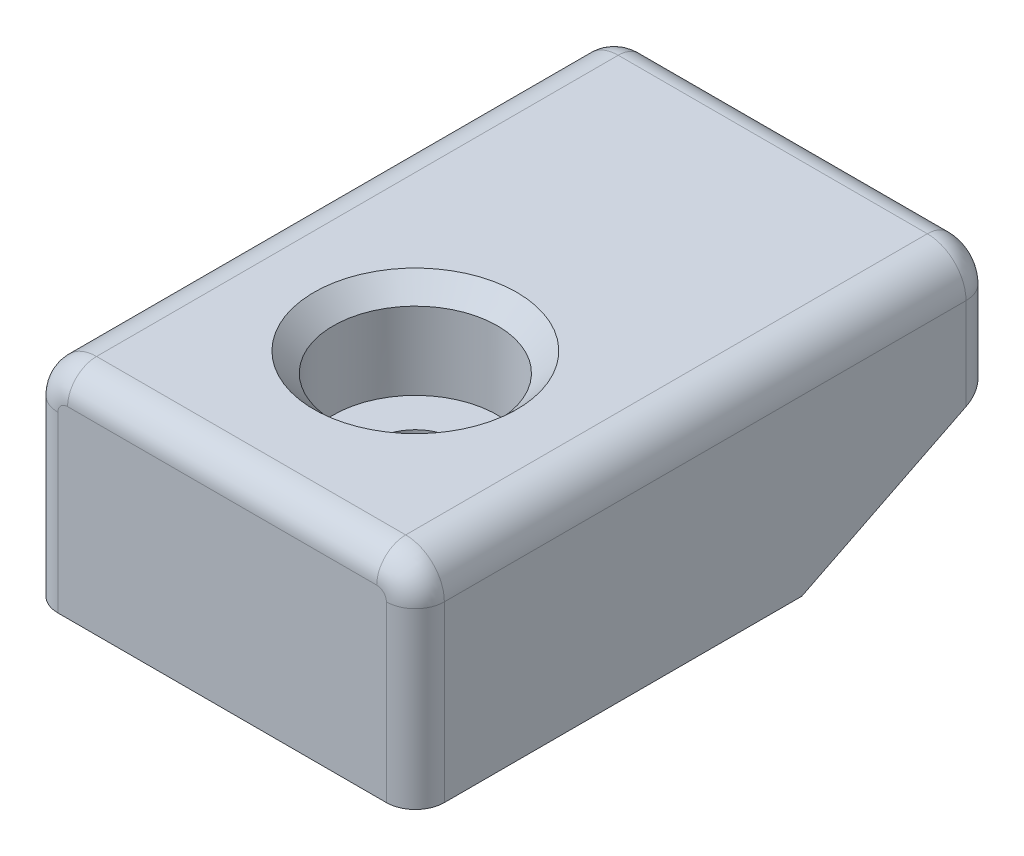
ISO-10303-21;
HEADER;
FILE_DESCRIPTION(('STEP AP214'),'2;1');
FILE_NAME('part.step','',(''),(''),'','','');
FILE_SCHEMA(('AUTOMOTIVE_DESIGN { 1 0 10303 214 1 1 1 1 }'));
ENDSEC;
DATA;
#1=APPLICATION_CONTEXT('core data for automotive mechanical design processes');
#2=APPLICATION_PROTOCOL_DEFINITION('international standard','automotive_design',2000,#1);
#3=PRODUCT_CONTEXT('',#1,'mechanical');
#4=PRODUCT('Part','Part','',(#3));
#5=PRODUCT_RELATED_PRODUCT_CATEGORY('part','',(#4));
#6=PRODUCT_DEFINITION_FORMATION('','',#4);
#7=PRODUCT_DEFINITION_CONTEXT('part definition',#1,'design');
#8=PRODUCT_DEFINITION('design','',#6,#7);
#9=PRODUCT_DEFINITION_SHAPE('','',#8);
#10=(LENGTH_UNIT() NAMED_UNIT(*) SI_UNIT(.MILLI.,.METRE.));
#11=(NAMED_UNIT(*) PLANE_ANGLE_UNIT() SI_UNIT($,.RADIAN.));
#12=(NAMED_UNIT(*) SI_UNIT($,.STERADIAN.) SOLID_ANGLE_UNIT());
#13=UNCERTAINTY_MEASURE_WITH_UNIT(LENGTH_MEASURE(1.E-05),#10,'distance_accuracy_value','');
#14=(GEOMETRIC_REPRESENTATION_CONTEXT(3) GLOBAL_UNCERTAINTY_ASSIGNED_CONTEXT((#13)) GLOBAL_UNIT_ASSIGNED_CONTEXT((#10,
#11,#12)) REPRESENTATION_CONTEXT('',''));
#15=CARTESIAN_POINT('',(0.,0.,0.));
#16=DIRECTION('',(0.,0.,1.));
#17=DIRECTION('',(1.,0.,0.));
#18=AXIS2_PLACEMENT_3D('',#15,#16,#17);
#19=CARTESIAN_POINT('',(0.,11.,9.91087244163016));
#20=DIRECTION('',(0.,-1.,0.));
#21=DIRECTION('',(0.,0.,-1.));
#22=AXIS2_PLACEMENT_3D('',#19,#20,#21);
#23=CYLINDRICAL_SURFACE('',#22,4.15);
#24=CARTESIAN_POINT('',(0.,-11.,9.91087244163016));
#25=DIRECTION('',(0.,1.,0.));
#26=DIRECTION('',(0.,0.,1.));
#27=AXIS2_PLACEMENT_3D('',#24,#25,#26);
#28=CIRCLE('',#27,4.15);
#29=CARTESIAN_POINT('',(0.,-11.,14.0608724416302));
#30=VERTEX_POINT('',#29);
#31=EDGE_CURVE('E294',#30,#30,#28,.T.);
#32=ORIENTED_EDGE('',*,*,#31,.F.);
#33=EDGE_LOOP('',(#32));
#34=FACE_BOUND('',#33,.T.);
#35=CARTESIAN_POINT('',(0.,0.999999999999999,9.91087244163016));
#36=DIRECTION('',(0.,1.,0.));
#37=DIRECTION('',(0.,0.,1.));
#38=AXIS2_PLACEMENT_3D('',#35,#36,#37);
#39=CIRCLE('',#38,4.15);
#40=CARTESIAN_POINT('',(0.,0.999999999999999,14.0608724416302));
#41=VERTEX_POINT('',#40);
#42=EDGE_CURVE('E291',#41,#41,#39,.T.);
#43=ORIENTED_EDGE('',*,*,#42,.T.);
#44=EDGE_LOOP('',(#43));
#45=FACE_BOUND('',#44,.T.);
#46=ADVANCED_FACE('F42',(#34,#45),#23,.F.);
#47=CARTESIAN_POINT('',(0.,11.,0.));
#48=DIRECTION('',(0.,-1.,0.));
#49=DIRECTION('',(0.,0.,-1.));
#50=AXIS2_PLACEMENT_3D('',#47,#48,#49);
#51=PLANE('',#50);
#52=CARTESIAN_POINT('',(0.,11.,9.91087244163016));
#53=DIRECTION('',(0.,-1.,0.));
#54=DIRECTION('',(0.,0.,-1.));
#55=AXIS2_PLACEMENT_3D('',#52,#53,#54);
#56=CIRCLE('',#55,10.5);
#57=CARTESIAN_POINT('',(0.,11.,-0.589127558369852));
#58=VERTEX_POINT('',#57);
#59=EDGE_CURVE('E310',#58,#58,#56,.T.);
#60=ORIENTED_EDGE('',*,*,#59,.T.);
#61=EDGE_LOOP('',(#60));
#62=FACE_BOUND('',#61,.T.);
#63=DIRECTION('',(0.,0.,1.));
#64=VECTOR('',#63,1.);
#65=CARTESIAN_POINT('',(-16.0000000000001,11.,0.));
#66=LINE('',#65,#64);
#67=CARTESIAN_POINT('',(-16.0000000000001,11.,-27.0891275583698));
#68=VERTEX_POINT('',#67);
#69=CARTESIAN_POINT('',(-16.0000000000001,11.,26.9108724416302));
#70=VERTEX_POINT('',#69);
#71=EDGE_CURVE('E287',#68,#70,#66,.T.);
#72=ORIENTED_EDGE('',*,*,#71,.T.);
#73=DIRECTION('',(1.,0.,0.));
#74=VECTOR('',#73,1.);
#75=CARTESIAN_POINT('',(0.,11.,26.9108724416302));
#76=LINE('',#75,#74);
#77=CARTESIAN_POINT('',(15.9999999999999,11.,26.9108724416302));
#78=VERTEX_POINT('',#77);
#79=EDGE_CURVE('E11',#70,#78,#76,.T.);
#80=ORIENTED_EDGE('',*,*,#79,.T.);
#81=DIRECTION('',(0.,0.,-1.));
#82=VECTOR('',#81,1.);
#83=CARTESIAN_POINT('',(15.9999999999999,11.,0.));
#84=LINE('',#83,#82);
#85=CARTESIAN_POINT('',(15.9999999999999,11.,-27.0891275583698));
#86=VERTEX_POINT('',#85);
#87=EDGE_CURVE('E283',#78,#86,#84,.T.);
#88=ORIENTED_EDGE('',*,*,#87,.T.);
#89=DIRECTION('',(-1.,0.,0.));
#90=VECTOR('',#89,1.);
#91=CARTESIAN_POINT('',(0.,11.,-27.0891275583698));
#92=LINE('',#91,#90);
#93=EDGE_CURVE('E52',#86,#68,#92,.T.);
#94=ORIENTED_EDGE('',*,*,#93,.T.);
#95=EDGE_LOOP('',(#72,#80,#88,#94));
#96=FACE_BOUND('',#95,.T.);
#97=ADVANCED_FACE('F370',(#62,#96),#51,.F.);
#98=CARTESIAN_POINT('',(0.,-11.,0.));
#99=DIRECTION('',(0.,-1.,0.));
#100=DIRECTION('',(0.,0.,-1.));
#101=AXIS2_PLACEMENT_3D('',#98,#99,#100);
#102=PLANE('',#101);
#103=DIRECTION('',(0.,0.,-1.));
#104=VECTOR('',#103,1.);
#105=CARTESIAN_POINT('',(19.9999999999999,-11.,29.9108724416302));
#106=LINE('',#105,#104);
#107=CARTESIAN_POINT('',(19.9999999999999,-11.,26.9108724416302));
#108=VERTEX_POINT('',#107);
#109=CARTESIAN_POINT('',(19.9999999999999,-11.,-10.0891275583697));
#110=VERTEX_POINT('',#109);
#111=EDGE_CURVE('E164',#108,#110,#106,.T.);
#112=ORIENTED_EDGE('',*,*,#111,.F.);
#113=CARTESIAN_POINT('',(17.,-11.,26.9108724416302));
#114=DIRECTION('',(0.,-1.,0.));
#115=DIRECTION('',(0.,0.,-1.));
#116=AXIS2_PLACEMENT_3D('',#113,#114,#115);
#117=CIRCLE('',#116,3.);
#118=CARTESIAN_POINT('',(17.,-11.,29.9108724416302));
#119=VERTEX_POINT('',#118);
#120=EDGE_CURVE('E224',#108,#119,#117,.T.);
#121=ORIENTED_EDGE('',*,*,#120,.T.);
#122=DIRECTION('',(1.,0.,0.));
#123=VECTOR('',#122,1.);
#124=CARTESIAN_POINT('',(-20.0000000000001,-11.,29.9108724416302));
#125=LINE('',#124,#123);
#126=CARTESIAN_POINT('',(-17.0000000000001,-11.,29.9108724416302));
#127=VERTEX_POINT('',#126);
#128=EDGE_CURVE('E163',#127,#119,#125,.T.);
#129=ORIENTED_EDGE('',*,*,#128,.F.);
#130=CARTESIAN_POINT('',(-17.0000000000001,-11.,26.9108724416302));
#131=DIRECTION('',(0.,-1.,0.));
#132=DIRECTION('',(0.,0.,-1.));
#133=AXIS2_PLACEMENT_3D('',#130,#131,#132);
#134=CIRCLE('',#133,3.);
#135=CARTESIAN_POINT('',(-20.0000000000001,-11.,26.9108724416302));
#136=VERTEX_POINT('',#135);
#137=EDGE_CURVE('E161',#127,#136,#134,.T.);
#138=ORIENTED_EDGE('',*,*,#137,.T.);
#139=DIRECTION('',(0.,0.,1.));
#140=VECTOR('',#139,1.);
#141=CARTESIAN_POINT('',(-20.0000000000001,-11.,29.9108724416302));
#142=LINE('',#141,#140);
#143=CARTESIAN_POINT('',(-20.0000000000001,-11.,-10.0891275583697));
#144=VERTEX_POINT('',#143);
#145=EDGE_CURVE('E142',#144,#136,#142,.T.);
#146=ORIENTED_EDGE('',*,*,#145,.F.);
#147=DIRECTION('',(1.,0.,0.));
#148=VECTOR('',#147,1.);
#149=CARTESIAN_POINT('',(19.9999999999999,-11.,-10.0891275583697));
#150=LINE('',#149,#148);
#151=EDGE_CURVE('E150',#144,#110,#150,.T.);
#152=ORIENTED_EDGE('',*,*,#151,.T.);
#153=EDGE_LOOP('',(#112,#121,#129,#138,#146,#152));
#154=FACE_BOUND('',#153,.T.);
#155=ORIENTED_EDGE('',*,*,#31,.T.);
#156=EDGE_LOOP('',(#155));
#157=FACE_BOUND('',#156,.T.);
#158=ADVANCED_FACE('F156',(#154,#157),#102,.T.);
#159=CARTESIAN_POINT('',(19.9999999999999,11.,29.9108724416302));
#160=DIRECTION('',(-1.,0.,0.));
#161=DIRECTION('',(0.,0.,1.));
#162=AXIS2_PLACEMENT_3D('',#159,#160,#161);
#163=PLANE('',#162);
#164=DIRECTION('',(0.,0.447213595499956,-0.894427190999917));
#165=VECTOR('',#164,1.);
#166=CARTESIAN_POINT('',(19.9999999999999,-0.999999999999997,-30.0891275583698));
#167=LINE('',#166,#165);
#168=CARTESIAN_POINT('',(19.9999999999999,-2.49999999999999,-27.0891275583698));
#169=VERTEX_POINT('',#168);
#170=EDGE_CURVE('E169',#110,#169,#167,.T.);
#171=ORIENTED_EDGE('',*,*,#170,.T.);
#172=DIRECTION('',(0.,-1.,0.));
#173=VECTOR('',#172,1.);
#174=CARTESIAN_POINT('',(19.9999999999999,11.,-27.0891275583698));
#175=LINE('',#174,#173);
#176=CARTESIAN_POINT('',(19.9999999999999,7.,-27.0891275583698));
#177=VERTEX_POINT('',#176);
#178=EDGE_CURVE('E202',#169,#177,#175,.F.);
#179=ORIENTED_EDGE('',*,*,#178,.T.);
#180=DIRECTION('',(0.,0.,-1.));
#181=VECTOR('',#180,1.);
#182=CARTESIAN_POINT('',(19.9999999999999,7.,29.9108724416302));
#183=LINE('',#182,#181);
#184=CARTESIAN_POINT('',(19.9999999999999,7.,26.9108724416302));
#185=VERTEX_POINT('',#184);
#186=EDGE_CURVE('E302',#177,#185,#183,.F.);
#187=ORIENTED_EDGE('',*,*,#186,.T.);
#188=DIRECTION('',(0.,-1.,0.));
#189=VECTOR('',#188,1.);
#190=CARTESIAN_POINT('',(19.9999999999999,11.,26.9108724416302));
#191=LINE('',#190,#189);
#192=EDGE_CURVE('E198',#185,#108,#191,.T.);
#193=ORIENTED_EDGE('',*,*,#192,.T.);
#194=ORIENTED_EDGE('',*,*,#111,.T.);
#195=EDGE_LOOP('',(#171,#179,#187,#193,#194));
#196=FACE_BOUND('',#195,.T.);
#197=ADVANCED_FACE('F341',(#196),#163,.F.);
#198=CARTESIAN_POINT('',(-20.0000000000001,11.,-30.0891275583698));
#199=DIRECTION('',(0.,0.,1.));
#200=DIRECTION('',(1.,0.,0.));
#201=AXIS2_PLACEMENT_3D('',#198,#199,#200);
#202=PLANE('',#201);
#203=CARTESIAN_POINT('',(15.9999999999999,7.,-30.0891275583698));
#204=DIRECTION('',(0.,0.,1.));
#205=DIRECTION('',(1.,0.,0.));
#206=AXIS2_PLACEMENT_3D('',#203,#204,#205);
#207=CIRCLE('',#206,1.);
#208=CARTESIAN_POINT('',(15.9999999999999,8.,-30.0891275583698));
#209=VERTEX_POINT('',#208);
#210=CARTESIAN_POINT('',(17.,7.,-30.0891275583698));
#211=VERTEX_POINT('',#210);
#212=EDGE_CURVE('E185',#209,#211,#207,.F.);
#213=ORIENTED_EDGE('',*,*,#212,.T.);
#214=DIRECTION('',(0.,-1.,0.));
#215=VECTOR('',#214,1.);
#216=CARTESIAN_POINT('',(17.,11.,-30.0891275583698));
#217=LINE('',#216,#215);
#218=CARTESIAN_POINT('',(17.,-0.999999999999997,-30.0891275583698));
#219=VERTEX_POINT('',#218);
#220=EDGE_CURVE('E188',#211,#219,#217,.T.);
#221=ORIENTED_EDGE('',*,*,#220,.T.);
#222=DIRECTION('',(-1.,0.,0.));
#223=VECTOR('',#222,1.);
#224=CARTESIAN_POINT('',(-20.0000000000001,-0.999999999999997,-30.0891275583698));
#225=LINE('',#224,#223);
#226=CARTESIAN_POINT('',(-17.0000000000001,-0.999999999999997,-30.0891275583698));
#227=VERTEX_POINT('',#226);
#228=EDGE_CURVE('E151',#219,#227,#225,.T.);
#229=ORIENTED_EDGE('',*,*,#228,.T.);
#230=DIRECTION('',(0.,-1.,0.));
#231=VECTOR('',#230,1.);
#232=CARTESIAN_POINT('',(-17.0000000000001,11.,-30.0891275583698));
#233=LINE('',#232,#231);
#234=CARTESIAN_POINT('',(-17.0000000000001,7.,-30.0891275583698));
#235=VERTEX_POINT('',#234);
#236=EDGE_CURVE('E182',#227,#235,#233,.F.);
#237=ORIENTED_EDGE('',*,*,#236,.T.);
#238=CARTESIAN_POINT('',(-16.0000000000001,7.,-30.0891275583698));
#239=DIRECTION('',(0.,0.,1.));
#240=DIRECTION('',(1.,0.,0.));
#241=AXIS2_PLACEMENT_3D('',#238,#239,#240);
#242=CIRCLE('',#241,1.);
#243=CARTESIAN_POINT('',(-16.0000000000001,8.,-30.0891275583698));
#244=VERTEX_POINT('',#243);
#245=EDGE_CURVE('E179',#235,#244,#242,.F.);
#246=ORIENTED_EDGE('',*,*,#245,.T.);
#247=DIRECTION('',(-1.,0.,0.));
#248=VECTOR('',#247,1.);
#249=CARTESIAN_POINT('',(-20.0000000000001,8.,-30.0891275583698));
#250=LINE('',#249,#248);
#251=EDGE_CURVE('E173',#244,#209,#250,.F.);
#252=ORIENTED_EDGE('',*,*,#251,.T.);
#253=EDGE_LOOP('',(#213,#221,#229,#237,#246,#252));
#254=FACE_BOUND('',#253,.T.);
#255=ADVANCED_FACE('F317',(#254),#202,.F.);
#256=CARTESIAN_POINT('',(-20.0000000000001,11.,29.9108724416302));
#257=DIRECTION('',(1.,0.,0.));
#258=DIRECTION('',(0.,0.,-1.));
#259=AXIS2_PLACEMENT_3D('',#256,#257,#258);
#260=PLANE('',#259);
#261=DIRECTION('',(0.,0.,1.));
#262=VECTOR('',#261,1.);
#263=CARTESIAN_POINT('',(-20.0000000000001,7.,29.9108724416302));
#264=LINE('',#263,#262);
#265=CARTESIAN_POINT('',(-20.0000000000001,7.,26.9108724416302));
#266=VERTEX_POINT('',#265);
#267=CARTESIAN_POINT('',(-20.0000000000001,7.,-27.0891275583698));
#268=VERTEX_POINT('',#267);
#269=EDGE_CURVE('E299',#266,#268,#264,.F.);
#270=ORIENTED_EDGE('',*,*,#269,.T.);
#271=DIRECTION('',(0.,-1.,0.));
#272=VECTOR('',#271,1.);
#273=CARTESIAN_POINT('',(-20.0000000000001,11.,-27.0891275583698));
#274=LINE('',#273,#272);
#275=CARTESIAN_POINT('',(-20.0000000000001,-2.49999999999999,-27.0891275583698));
#276=VERTEX_POINT('',#275);
#277=EDGE_CURVE('E145',#268,#276,#274,.T.);
#278=ORIENTED_EDGE('',*,*,#277,.T.);
#279=DIRECTION('',(0.,-0.447213595499956,0.894427190999917));
#280=VECTOR('',#279,1.);
#281=CARTESIAN_POINT('',(-20.0000000000001,-0.999999999999997,-30.0891275583698));
#282=LINE('',#281,#280);
#283=EDGE_CURVE('E138',#276,#144,#282,.T.);
#284=ORIENTED_EDGE('',*,*,#283,.T.);
#285=ORIENTED_EDGE('',*,*,#145,.T.);
#286=DIRECTION('',(0.,-1.,0.));
#287=VECTOR('',#286,1.);
#288=CARTESIAN_POINT('',(-20.0000000000001,11.,26.9108724416302));
#289=LINE('',#288,#287);
#290=EDGE_CURVE('E211',#136,#266,#289,.F.);
#291=ORIENTED_EDGE('',*,*,#290,.T.);
#292=EDGE_LOOP('',(#270,#278,#284,#285,#291));
#293=FACE_BOUND('',#292,.T.);
#294=ADVANCED_FACE('F141',(#293),#260,.F.);
#295=CARTESIAN_POINT('',(-20.0000000000001,11.,29.9108724416302));
#296=DIRECTION('',(0.,0.,-1.));
#297=DIRECTION('',(-1.,0.,0.));
#298=AXIS2_PLACEMENT_3D('',#295,#296,#297);
#299=PLANE('',#298);
#300=ORIENTED_EDGE('',*,*,#128,.T.);
#301=DIRECTION('',(0.,-1.,0.));
#302=VECTOR('',#301,1.);
#303=CARTESIAN_POINT('',(17.,11.,29.9108724416302));
#304=LINE('',#303,#302);
#305=CARTESIAN_POINT('',(17.,7.,29.9108724416302));
#306=VERTEX_POINT('',#305);
#307=EDGE_CURVE('E60',#119,#306,#304,.F.);
#308=ORIENTED_EDGE('',*,*,#307,.T.);
#309=CARTESIAN_POINT('',(15.9999999999999,7.,29.9108724416302));
#310=DIRECTION('',(0.,0.,-1.));
#311=DIRECTION('',(-1.,0.,0.));
#312=AXIS2_PLACEMENT_3D('',#309,#310,#311);
#313=CIRCLE('',#312,1.);
#314=CARTESIAN_POINT('',(15.9999999999999,8.,29.9108724416302));
#315=VERTEX_POINT('',#314);
#316=EDGE_CURVE('E64',#306,#315,#313,.F.);
#317=ORIENTED_EDGE('',*,*,#316,.T.);
#318=DIRECTION('',(1.,0.,0.));
#319=VECTOR('',#318,1.);
#320=CARTESIAN_POINT('',(-20.0000000000001,8.,29.9108724416302));
#321=LINE('',#320,#319);
#322=CARTESIAN_POINT('',(-16.0000000000001,8.,29.9108724416302));
#323=VERTEX_POINT('',#322);
#324=EDGE_CURVE('E233',#315,#323,#321,.F.);
#325=ORIENTED_EDGE('',*,*,#324,.T.);
#326=CARTESIAN_POINT('',(-16.0000000000001,7.,29.9108724416302));
#327=DIRECTION('',(0.,0.,-1.));
#328=DIRECTION('',(-1.,0.,0.));
#329=AXIS2_PLACEMENT_3D('',#326,#327,#328);
#330=CIRCLE('',#329,1.);
#331=CARTESIAN_POINT('',(-17.0000000000001,7.,29.9108724416302));
#332=VERTEX_POINT('',#331);
#333=EDGE_CURVE('E230',#323,#332,#330,.F.);
#334=ORIENTED_EDGE('',*,*,#333,.T.);
#335=DIRECTION('',(0.,-1.,0.));
#336=VECTOR('',#335,1.);
#337=CARTESIAN_POINT('',(-17.0000000000001,11.,29.9108724416302));
#338=LINE('',#337,#336);
#339=EDGE_CURVE('E227',#332,#127,#338,.T.);
#340=ORIENTED_EDGE('',*,*,#339,.T.);
#341=EDGE_LOOP('',(#300,#308,#317,#325,#334,#340));
#342=FACE_BOUND('',#341,.T.);
#343=ADVANCED_FACE('F281',(#342),#299,.F.);
#344=CARTESIAN_POINT('',(0.,0.999999999999999,9.91087244163016));
#345=DIRECTION('',(0.,1.,0.));
#346=DIRECTION('',(0.,0.,1.));
#347=AXIS2_PLACEMENT_3D('',#344,#345,#346);
#348=CYLINDRICAL_SURFACE('',#347,8.5);
#349=CARTESIAN_POINT('',(0.,8.99999999999999,9.91087244163016));
#350=DIRECTION('',(0.,-1.,0.));
#351=DIRECTION('',(0.,0.,-1.));
#352=AXIS2_PLACEMENT_3D('',#349,#350,#351);
#353=CIRCLE('',#352,8.5);
#354=CARTESIAN_POINT('',(0.,8.99999999999999,1.41087244163016));
#355=VERTEX_POINT('',#354);
#356=EDGE_CURVE('E306',#355,#355,#353,.F.);
#357=ORIENTED_EDGE('',*,*,#356,.T.);
#358=EDGE_LOOP('',(#357));
#359=FACE_BOUND('',#358,.T.);
#360=CARTESIAN_POINT('',(0.,0.999999999999999,9.91087244163016));
#361=DIRECTION('',(0.,1.,0.));
#362=DIRECTION('',(0.,0.,1.));
#363=AXIS2_PLACEMENT_3D('',#360,#361,#362);
#364=CIRCLE('',#363,8.5);
#365=CARTESIAN_POINT('',(0.,0.999999999999999,18.4108724416302));
#366=VERTEX_POINT('',#365);
#367=EDGE_CURVE('E258',#366,#366,#364,.T.);
#368=ORIENTED_EDGE('',*,*,#367,.F.);
#369=EDGE_LOOP('',(#368));
#370=FACE_BOUND('',#369,.T.);
#371=ADVANCED_FACE('F355',(#359,#370),#348,.F.);
#372=CARTESIAN_POINT('',(0.,0.999999999999999,9.91087244163016));
#373=DIRECTION('',(0.,1.,0.));
#374=DIRECTION('',(0.,0.,1.));
#375=AXIS2_PLACEMENT_3D('',#372,#373,#374);
#376=PLANE('',#375);
#377=ORIENTED_EDGE('',*,*,#42,.F.);
#378=EDGE_LOOP('',(#377));
#379=FACE_BOUND('',#378,.T.);
#380=ORIENTED_EDGE('',*,*,#367,.T.);
#381=EDGE_LOOP('',(#380));
#382=FACE_BOUND('',#381,.T.);
#383=ADVANCED_FACE('F353',(#379,#382),#376,.T.);
#384=CARTESIAN_POINT('',(-16.0000000000001,7.,0.));
#385=DIRECTION('',(0.,0.,1.));
#386=DIRECTION('',(1.,0.,0.));
#387=AXIS2_PLACEMENT_3D('',#384,#385,#386);
#388=CYLINDRICAL_SURFACE('',#387,4.);
#389=ORIENTED_EDGE('',*,*,#71,.F.);
#390=CARTESIAN_POINT('',(-16.0000000000001,7.,-27.0891275583698));
#391=DIRECTION('',(0.,0.,1.));
#392=DIRECTION('',(1.,0.,0.));
#393=AXIS2_PLACEMENT_3D('',#390,#391,#392);
#394=CIRCLE('',#393,4.);
#395=EDGE_CURVE('E219',#68,#268,#394,.T.);
#396=ORIENTED_EDGE('',*,*,#395,.T.);
#397=ORIENTED_EDGE('',*,*,#269,.F.);
#398=CARTESIAN_POINT('',(-16.0000000000001,7.,26.9108724416302));
#399=DIRECTION('',(0.,0.,-1.));
#400=DIRECTION('',(-1.,0.,0.));
#401=AXIS2_PLACEMENT_3D('',#398,#399,#400);
#402=CIRCLE('',#401,4.);
#403=EDGE_CURVE('E216',#266,#70,#402,.T.);
#404=ORIENTED_EDGE('',*,*,#403,.T.);
#405=EDGE_LOOP('',(#389,#396,#397,#404));
#406=FACE_BOUND('',#405,.T.);
#407=ADVANCED_FACE('F363',(#406),#388,.T.);
#408=CARTESIAN_POINT('',(15.9999999999999,7.,0.));
#409=DIRECTION('',(0.,0.,-1.));
#410=DIRECTION('',(-1.,0.,0.));
#411=AXIS2_PLACEMENT_3D('',#408,#409,#410);
#412=CYLINDRICAL_SURFACE('',#411,4.);
#413=ORIENTED_EDGE('',*,*,#186,.F.);
#414=CARTESIAN_POINT('',(15.9999999999999,7.,-27.0891275583698));
#415=DIRECTION('',(0.,0.,1.));
#416=DIRECTION('',(1.,0.,0.));
#417=AXIS2_PLACEMENT_3D('',#414,#415,#416);
#418=CIRCLE('',#417,4.);
#419=EDGE_CURVE('E208',#177,#86,#418,.T.);
#420=ORIENTED_EDGE('',*,*,#419,.T.);
#421=ORIENTED_EDGE('',*,*,#87,.F.);
#422=CARTESIAN_POINT('',(15.9999999999999,7.,26.9108724416302));
#423=DIRECTION('',(0.,0.,-1.));
#424=DIRECTION('',(-1.,0.,0.));
#425=AXIS2_PLACEMENT_3D('',#422,#423,#424);
#426=CIRCLE('',#425,4.);
#427=EDGE_CURVE('E205',#78,#185,#426,.T.);
#428=ORIENTED_EDGE('',*,*,#427,.T.);
#429=EDGE_LOOP('',(#413,#420,#421,#428));
#430=FACE_BOUND('',#429,.T.);
#431=ADVANCED_FACE('F391',(#430),#412,.T.);
#432=CARTESIAN_POINT('',(0.,8.99999999999999,9.91087244163016));
#433=DIRECTION('',(0.,1.,0.));
#434=DIRECTION('',(0.,0.,1.));
#435=AXIS2_PLACEMENT_3D('',#432,#433,#434);
#436=CONICAL_SURFACE('',#435,8.5,0.78539816339745);
#437=ORIENTED_EDGE('',*,*,#59,.F.);
#438=EDGE_LOOP('',(#437));
#439=FACE_BOUND('',#438,.T.);
#440=ORIENTED_EDGE('',*,*,#356,.F.);
#441=EDGE_LOOP('',(#440));
#442=FACE_BOUND('',#441,.T.);
#443=ADVANCED_FACE('F395',(#439,#442),#436,.F.);
#444=CARTESIAN_POINT('',(-20.0000000000001,-0.999999999999997,-30.0891275583698));
#445=DIRECTION('',(0.,-0.894427190999917,-0.447213595499956));
#446=DIRECTION('',(1.,0.,0.));
#447=AXIS2_PLACEMENT_3D('',#444,#445,#446);
#448=PLANE('',#447);
#449=ORIENTED_EDGE('',*,*,#228,.F.);
#450=CARTESIAN_POINT('',(17.,-2.49999999999999,-27.0891275583698));
#451=DIRECTION('',(0.,-0.894427190999917,-0.447213595499956));
#452=DIRECTION('',(0.,-0.447213595499956,0.894427190999917));
#453=AXIS2_PLACEMENT_3D('',#450,#451,#452);
#454=ELLIPSE('',#453,3.35410196624968,3.);
#455=EDGE_CURVE('E195',#219,#169,#454,.T.);
#456=ORIENTED_EDGE('',*,*,#455,.T.);
#457=ORIENTED_EDGE('',*,*,#170,.F.);
#458=ORIENTED_EDGE('',*,*,#151,.F.);
#459=ORIENTED_EDGE('',*,*,#283,.F.);
#460=CARTESIAN_POINT('',(-17.0000000000001,-2.49999999999999,-27.0891275583698));
#461=DIRECTION('',(0.,-0.894427190999917,-0.447213595499956));
#462=DIRECTION('',(0.,-0.447213595499956,0.894427190999917));
#463=AXIS2_PLACEMENT_3D('',#460,#461,#462);
#464=ELLIPSE('',#463,3.35410196624968,3.);
#465=EDGE_CURVE('E192',#276,#227,#464,.T.);
#466=ORIENTED_EDGE('',*,*,#465,.T.);
#467=EDGE_LOOP('',(#449,#456,#457,#458,#459,#466));
#468=FACE_BOUND('',#467,.T.);
#469=ADVANCED_FACE('F167',(#468),#448,.T.);
#470=CARTESIAN_POINT('',(-17.0000000000001,11.,-27.0891275583698));
#471=DIRECTION('',(0.,-1.,0.));
#472=DIRECTION('',(0.,0.,-1.));
#473=AXIS2_PLACEMENT_3D('',#470,#471,#472);
#474=CYLINDRICAL_SURFACE('',#473,3.);
#475=ORIENTED_EDGE('',*,*,#465,.F.);
#476=ORIENTED_EDGE('',*,*,#277,.F.);
#477=CARTESIAN_POINT('',(-17.0000000000001,7.,-27.0891275583698));
#478=DIRECTION('',(0.,1.,0.));
#479=DIRECTION('',(0.,0.,1.));
#480=AXIS2_PLACEMENT_3D('',#477,#478,#479);
#481=CIRCLE('',#480,3.);
#482=EDGE_CURVE('E254',#235,#268,#481,.T.);
#483=ORIENTED_EDGE('',*,*,#482,.F.);
#484=ORIENTED_EDGE('',*,*,#236,.F.);
#485=EDGE_LOOP('',(#475,#476,#483,#484));
#486=FACE_BOUND('',#485,.T.);
#487=ADVANCED_FACE('F321',(#486),#474,.T.);
#488=CARTESIAN_POINT('',(-16.0000000000001,7.,-27.0891275583698));
#489=DIRECTION('',(0.,0.,1.));
#490=DIRECTION('',(1.,0.,0.));
#491=AXIS2_PLACEMENT_3D('',#488,#489,#490);
#492=DEGENERATE_TOROIDAL_SURFACE('',#491,1.,3.,.T.);
#493=ORIENTED_EDGE('',*,*,#482,.T.);
#494=ORIENTED_EDGE('',*,*,#395,.F.);
#495=CARTESIAN_POINT('',(-16.0000000000001,8.,-27.0891275583698));
#496=DIRECTION('',(1.,0.,0.));
#497=DIRECTION('',(0.,0.,-1.));
#498=AXIS2_PLACEMENT_3D('',#495,#496,#497);
#499=CIRCLE('',#498,3.);
#500=EDGE_CURVE('E250',#244,#68,#499,.T.);
#501=ORIENTED_EDGE('',*,*,#500,.F.);
#502=ORIENTED_EDGE('',*,*,#245,.F.);
#503=EDGE_LOOP('',(#493,#494,#501,#502));
#504=FACE_BOUND('',#503,.T.);
#505=ADVANCED_FACE('F326',(#504),#492,.T.);
#506=CARTESIAN_POINT('',(0.,8.,-27.0891275583698));
#507=DIRECTION('',(-1.,0.,0.));
#508=DIRECTION('',(0.,0.,1.));
#509=AXIS2_PLACEMENT_3D('',#506,#507,#508);
#510=CYLINDRICAL_SURFACE('',#509,3.);
#511=ORIENTED_EDGE('',*,*,#500,.T.);
#512=ORIENTED_EDGE('',*,*,#93,.F.);
#513=CARTESIAN_POINT('',(15.9999999999999,8.,-27.0891275583698));
#514=DIRECTION('',(1.,0.,0.));
#515=DIRECTION('',(0.,0.,-1.));
#516=AXIS2_PLACEMENT_3D('',#513,#514,#515);
#517=CIRCLE('',#516,3.);
#518=EDGE_CURVE('E246',#209,#86,#517,.T.);
#519=ORIENTED_EDGE('',*,*,#518,.F.);
#520=ORIENTED_EDGE('',*,*,#251,.F.);
#521=EDGE_LOOP('',(#511,#512,#519,#520));
#522=FACE_BOUND('',#521,.T.);
#523=ADVANCED_FACE('F333',(#522),#510,.T.);
#524=CARTESIAN_POINT('',(15.9999999999999,7.,-27.0891275583698));
#525=DIRECTION('',(0.,0.,1.));
#526=DIRECTION('',(1.,0.,0.));
#527=AXIS2_PLACEMENT_3D('',#524,#525,#526);
#528=DEGENERATE_TOROIDAL_SURFACE('',#527,1.,3.,.T.);
#529=ORIENTED_EDGE('',*,*,#518,.T.);
#530=ORIENTED_EDGE('',*,*,#419,.F.);
#531=CARTESIAN_POINT('',(17.,7.,-27.0891275583698));
#532=DIRECTION('',(0.,-1.,0.));
#533=DIRECTION('',(0.,0.,-1.));
#534=AXIS2_PLACEMENT_3D('',#531,#532,#533);
#535=CIRCLE('',#534,3.);
#536=EDGE_CURVE('E242',#211,#177,#535,.T.);
#537=ORIENTED_EDGE('',*,*,#536,.F.);
#538=ORIENTED_EDGE('',*,*,#212,.F.);
#539=EDGE_LOOP('',(#529,#530,#537,#538));
#540=FACE_BOUND('',#539,.T.);
#541=ADVANCED_FACE('F336',(#540),#528,.T.);
#542=CARTESIAN_POINT('',(17.,11.,-27.0891275583698));
#543=DIRECTION('',(0.,-1.,0.));
#544=DIRECTION('',(0.,0.,-1.));
#545=AXIS2_PLACEMENT_3D('',#542,#543,#544);
#546=CYLINDRICAL_SURFACE('',#545,3.);
#547=ORIENTED_EDGE('',*,*,#536,.T.);
#548=ORIENTED_EDGE('',*,*,#178,.F.);
#549=ORIENTED_EDGE('',*,*,#455,.F.);
#550=ORIENTED_EDGE('',*,*,#220,.F.);
#551=EDGE_LOOP('',(#547,#548,#549,#550));
#552=FACE_BOUND('',#551,.T.);
#553=ADVANCED_FACE('F339',(#552),#546,.T.);
#554=CARTESIAN_POINT('',(-17.0000000000001,11.,26.9108724416302));
#555=DIRECTION('',(0.,-1.,0.));
#556=DIRECTION('',(0.,0.,-1.));
#557=AXIS2_PLACEMENT_3D('',#554,#555,#556);
#558=CYLINDRICAL_SURFACE('',#557,3.);
#559=ORIENTED_EDGE('',*,*,#137,.F.);
#560=ORIENTED_EDGE('',*,*,#339,.F.);
#561=CARTESIAN_POINT('',(-17.0000000000001,7.,26.9108724416302));
#562=DIRECTION('',(0.,1.,0.));
#563=DIRECTION('',(0.,0.,1.));
#564=AXIS2_PLACEMENT_3D('',#561,#562,#563);
#565=CIRCLE('',#564,3.);
#566=EDGE_CURVE('E46',#266,#332,#565,.T.);
#567=ORIENTED_EDGE('',*,*,#566,.F.);
#568=ORIENTED_EDGE('',*,*,#290,.F.);
#569=EDGE_LOOP('',(#559,#560,#567,#568));
#570=FACE_BOUND('',#569,.T.);
#571=ADVANCED_FACE('F44',(#570),#558,.T.);
#572=CARTESIAN_POINT('',(-16.0000000000001,7.,26.9108724416302));
#573=DIRECTION('',(0.,0.,-1.));
#574=DIRECTION('',(-1.,0.,0.));
#575=AXIS2_PLACEMENT_3D('',#572,#573,#574);
#576=DEGENERATE_TOROIDAL_SURFACE('',#575,1.,3.,.T.);
#577=ORIENTED_EDGE('',*,*,#566,.T.);
#578=ORIENTED_EDGE('',*,*,#333,.F.);
#579=CARTESIAN_POINT('',(-16.0000000000001,8.,26.9108724416302));
#580=DIRECTION('',(1.,0.,0.));
#581=DIRECTION('',(0.,0.,-1.));
#582=AXIS2_PLACEMENT_3D('',#579,#580,#581);
#583=CIRCLE('',#582,3.);
#584=EDGE_CURVE('E266',#70,#323,#583,.T.);
#585=ORIENTED_EDGE('',*,*,#584,.F.);
#586=ORIENTED_EDGE('',*,*,#403,.F.);
#587=EDGE_LOOP('',(#577,#578,#585,#586));
#588=FACE_BOUND('',#587,.T.);
#589=ADVANCED_FACE('F278',(#588),#576,.T.);
#590=CARTESIAN_POINT('',(0.,8.,26.9108724416302));
#591=DIRECTION('',(1.,0.,0.));
#592=DIRECTION('',(0.,0.,-1.));
#593=AXIS2_PLACEMENT_3D('',#590,#591,#592);
#594=CYLINDRICAL_SURFACE('',#593,3.);
#595=ORIENTED_EDGE('',*,*,#584,.T.);
#596=ORIENTED_EDGE('',*,*,#324,.F.);
#597=CARTESIAN_POINT('',(15.9999999999999,8.,26.9108724416302));
#598=DIRECTION('',(1.,0.,0.));
#599=DIRECTION('',(0.,0.,-1.));
#600=AXIS2_PLACEMENT_3D('',#597,#598,#599);
#601=CIRCLE('',#600,3.);
#602=EDGE_CURVE('E263',#78,#315,#601,.T.);
#603=ORIENTED_EDGE('',*,*,#602,.F.);
#604=ORIENTED_EDGE('',*,*,#79,.F.);
#605=EDGE_LOOP('',(#595,#596,#603,#604));
#606=FACE_BOUND('',#605,.T.);
#607=ADVANCED_FACE('F419',(#606),#594,.T.);
#608=CARTESIAN_POINT('',(15.9999999999999,7.,26.9108724416302));
#609=DIRECTION('',(0.,0.,-1.));
#610=DIRECTION('',(-1.,0.,0.));
#611=AXIS2_PLACEMENT_3D('',#608,#609,#610);
#612=DEGENERATE_TOROIDAL_SURFACE('',#611,1.,3.,.T.);
#613=ORIENTED_EDGE('',*,*,#602,.T.);
#614=ORIENTED_EDGE('',*,*,#316,.F.);
#615=CARTESIAN_POINT('',(17.,7.,26.9108724416302));
#616=DIRECTION('',(0.,-1.,0.));
#617=DIRECTION('',(0.,0.,-1.));
#618=AXIS2_PLACEMENT_3D('',#615,#616,#617);
#619=CIRCLE('',#618,3.);
#620=EDGE_CURVE('E259',#185,#306,#619,.T.);
#621=ORIENTED_EDGE('',*,*,#620,.F.);
#622=ORIENTED_EDGE('',*,*,#427,.F.);
#623=EDGE_LOOP('',(#613,#614,#621,#622));
#624=FACE_BOUND('',#623,.T.);
#625=ADVANCED_FACE('F415',(#624),#612,.T.);
#626=CARTESIAN_POINT('',(17.,11.,26.9108724416302));
#627=DIRECTION('',(0.,-1.,0.));
#628=DIRECTION('',(0.,0.,-1.));
#629=AXIS2_PLACEMENT_3D('',#626,#627,#628);
#630=CYLINDRICAL_SURFACE('',#629,3.);
#631=ORIENTED_EDGE('',*,*,#620,.T.);
#632=ORIENTED_EDGE('',*,*,#307,.F.);
#633=ORIENTED_EDGE('',*,*,#120,.F.);
#634=ORIENTED_EDGE('',*,*,#192,.F.);
#635=EDGE_LOOP('',(#631,#632,#633,#634));
#636=FACE_BOUND('',#635,.T.);
#637=ADVANCED_FACE('F412',(#636),#630,.T.);
#638=CLOSED_SHELL('',(#46,#97,#158,#197,#255,#294,#343,#371,#383,#407,#431,#443,#469,#487,#505,
#523,#541,#553,#571,#589,#607,#625,#637));
#639=MANIFOLD_SOLID_BREP('B2',#638);
#640=ADVANCED_BREP_SHAPE_REPRESENTATION('',(#18,#639),#14);
#641=SHAPE_DEFINITION_REPRESENTATION(#9,#640);
ENDSEC;
END-ISO-10303-21;
